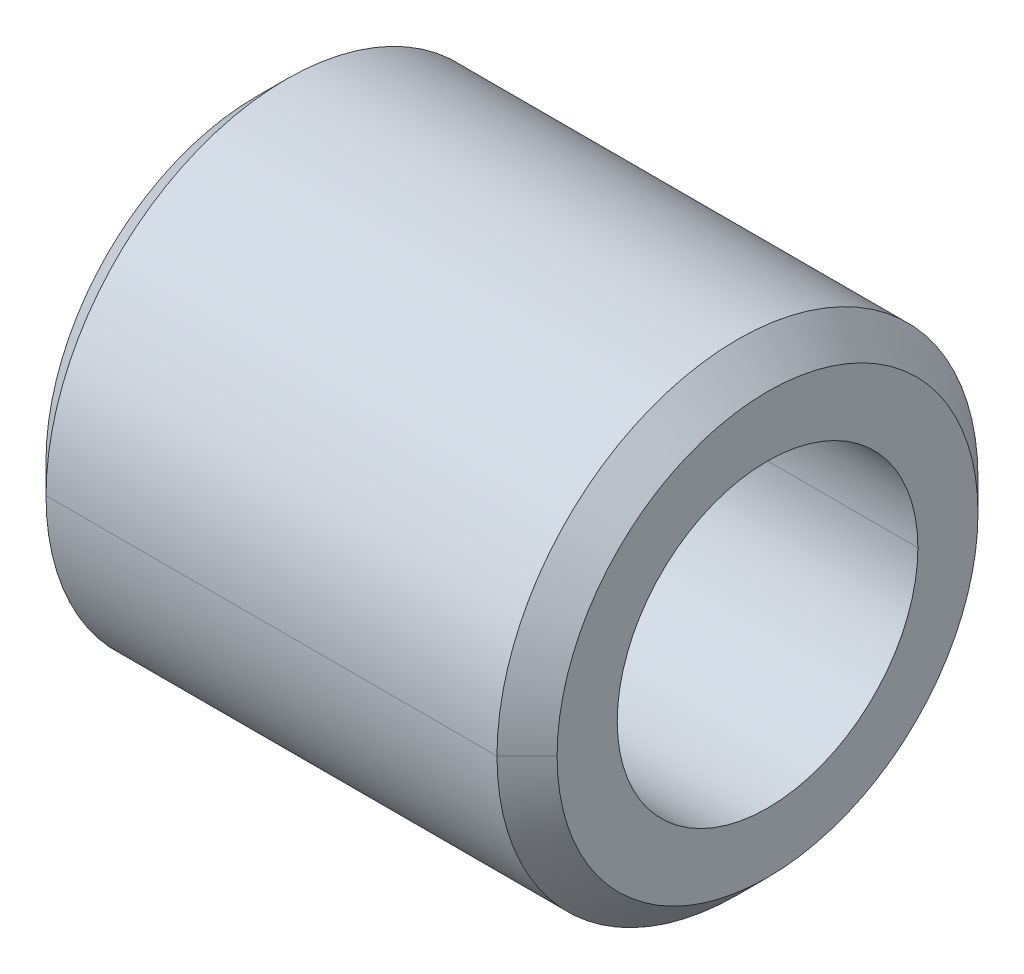
ISO-10303-21;
HEADER;
FILE_DESCRIPTION(('STEP AP214'),'2;1');
FILE_NAME('part.step','',(''),(''),'','','');
FILE_SCHEMA(('AUTOMOTIVE_DESIGN { 1 0 10303 214 1 1 1 1 }'));
ENDSEC;
DATA;
#1=APPLICATION_CONTEXT('core data for automotive mechanical design processes');
#2=APPLICATION_PROTOCOL_DEFINITION('international standard','automotive_design',2000,#1);
#3=PRODUCT_CONTEXT('',#1,'mechanical');
#4=PRODUCT('Part','Part','',(#3));
#5=PRODUCT_RELATED_PRODUCT_CATEGORY('part','',(#4));
#6=PRODUCT_DEFINITION_FORMATION('','',#4);
#7=PRODUCT_DEFINITION_CONTEXT('part definition',#1,'design');
#8=PRODUCT_DEFINITION('design','',#6,#7);
#9=PRODUCT_DEFINITION_SHAPE('','',#8);
#10=(LENGTH_UNIT() NAMED_UNIT(*) SI_UNIT(.MILLI.,.METRE.));
#11=(NAMED_UNIT(*) PLANE_ANGLE_UNIT() SI_UNIT($,.RADIAN.));
#12=(NAMED_UNIT(*) SI_UNIT($,.STERADIAN.) SOLID_ANGLE_UNIT());
#13=UNCERTAINTY_MEASURE_WITH_UNIT(LENGTH_MEASURE(1.E-05),#10,'distance_accuracy_value','');
#14=(GEOMETRIC_REPRESENTATION_CONTEXT(3) GLOBAL_UNCERTAINTY_ASSIGNED_CONTEXT((#13)) GLOBAL_UNIT_ASSIGNED_CONTEXT((#10,
#11,#12)) REPRESENTATION_CONTEXT('',''));
#15=CARTESIAN_POINT('',(0.,0.,0.));
#16=DIRECTION('',(0.,0.,1.));
#17=DIRECTION('',(1.,0.,0.));
#18=AXIS2_PLACEMENT_3D('',#15,#16,#17);
#19=CARTESIAN_POINT('',(4.25,0.,0.));
#20=DIRECTION('',(-1.,0.,0.));
#21=DIRECTION('',(0.,0.,1.));
#22=AXIS2_PLACEMENT_3D('',#19,#20,#21);
#23=CONICAL_SURFACE('',#22,3.5,0.785398163397446);
#24=CARTESIAN_POINT('',(4.25,0.,0.));
#25=DIRECTION('',(1.,0.,0.));
#26=DIRECTION('',(0.,0.,-1.));
#27=AXIS2_PLACEMENT_3D('',#24,#25,#26);
#28=CIRCLE('',#27,3.5);
#29=CARTESIAN_POINT('',(4.25,0.,-3.5));
#30=VERTEX_POINT('',#29);
#31=CARTESIAN_POINT('',(4.25,0.,3.5));
#32=VERTEX_POINT('',#31);
#33=EDGE_CURVE('E48',#30,#32,#28,.T.);
#34=ORIENTED_EDGE('',*,*,#33,.F.);
#35=DIRECTION('',(-0.707106781186549,0.,-0.707106781186546));
#36=VECTOR('',#35,1.);
#37=CARTESIAN_POINT('',(4.25,0.,-3.5));
#38=LINE('',#37,#36);
#39=CARTESIAN_POINT('',(3.75,0.,-4.));
#40=VERTEX_POINT('',#39);
#41=EDGE_CURVE('E13',#30,#40,#38,.T.);
#42=ORIENTED_EDGE('',*,*,#41,.T.);
#43=CARTESIAN_POINT('',(3.75,0.,0.));
#44=DIRECTION('',(-1.,0.,0.));
#45=DIRECTION('',(0.,0.,-1.));
#46=AXIS2_PLACEMENT_3D('',#43,#44,#45);
#47=CIRCLE('',#46,4.);
#48=CARTESIAN_POINT('',(3.75,0.,4.));
#49=VERTEX_POINT('',#48);
#50=EDGE_CURVE('E117',#49,#40,#47,.T.);
#51=ORIENTED_EDGE('',*,*,#50,.F.);
#52=DIRECTION('',(-0.707106781186549,0.,0.707106781186546));
#53=VECTOR('',#52,1.);
#54=CARTESIAN_POINT('',(4.25,0.,3.5));
#55=LINE('',#54,#53);
#56=EDGE_CURVE('E27',#32,#49,#55,.T.);
#57=ORIENTED_EDGE('',*,*,#56,.F.);
#58=EDGE_LOOP('',(#34,#42,#51,#57));
#59=FACE_BOUND('',#58,.T.);
#60=ADVANCED_FACE('F23',(#59),#23,.T.);
#61=CARTESIAN_POINT('',(-3.75,0.,0.));
#62=DIRECTION('',(1.,0.,0.));
#63=DIRECTION('',(0.,0.,-1.));
#64=AXIS2_PLACEMENT_3D('',#61,#62,#63);
#65=CONICAL_SURFACE('',#64,4.,0.78539816339745);
#66=CARTESIAN_POINT('',(-4.25,0.,0.));
#67=DIRECTION('',(-1.,0.,0.));
#68=DIRECTION('',(0.,0.,-1.));
#69=AXIS2_PLACEMENT_3D('',#66,#67,#68);
#70=CIRCLE('',#69,3.5);
#71=CARTESIAN_POINT('',(-4.25,0.,3.5));
#72=VERTEX_POINT('',#71);
#73=CARTESIAN_POINT('',(-4.25,0.,-3.5));
#74=VERTEX_POINT('',#73);
#75=EDGE_CURVE('E145',#72,#74,#70,.T.);
#76=ORIENTED_EDGE('',*,*,#75,.F.);
#77=DIRECTION('',(0.707106781186546,0.,0.707106781186549));
#78=VECTOR('',#77,1.);
#79=CARTESIAN_POINT('',(-3.75,0.,4.));
#80=LINE('',#79,#78);
#81=CARTESIAN_POINT('',(-3.75,0.,4.));
#82=VERTEX_POINT('',#81);
#83=EDGE_CURVE('E34',#72,#82,#80,.T.);
#84=ORIENTED_EDGE('',*,*,#83,.T.);
#85=CARTESIAN_POINT('',(-3.75,0.,0.));
#86=DIRECTION('',(1.,0.,0.));
#87=DIRECTION('',(0.,0.,-1.));
#88=AXIS2_PLACEMENT_3D('',#85,#86,#87);
#89=CIRCLE('',#88,4.);
#90=CARTESIAN_POINT('',(-3.75,0.,-4.));
#91=VERTEX_POINT('',#90);
#92=EDGE_CURVE('E118',#91,#82,#89,.T.);
#93=ORIENTED_EDGE('',*,*,#92,.F.);
#94=DIRECTION('',(0.707106781186546,0.,-0.707106781186549));
#95=VECTOR('',#94,1.);
#96=CARTESIAN_POINT('',(-3.75,0.,-4.));
#97=LINE('',#96,#95);
#98=EDGE_CURVE('E73',#74,#91,#97,.T.);
#99=ORIENTED_EDGE('',*,*,#98,.F.);
#100=EDGE_LOOP('',(#76,#84,#93,#99));
#101=FACE_BOUND('',#100,.T.);
#102=ADVANCED_FACE('F197',(#101),#65,.T.);
#103=CARTESIAN_POINT('',(4.25,0.,0.));
#104=DIRECTION('',(-1.,0.,0.));
#105=DIRECTION('',(0.,0.,1.));
#106=AXIS2_PLACEMENT_3D('',#103,#104,#105);
#107=CYLINDRICAL_SURFACE('',#106,2.5);
#108=CARTESIAN_POINT('',(4.25,0.,0.));
#109=DIRECTION('',(1.,0.,0.));
#110=DIRECTION('',(0.,0.,-1.));
#111=AXIS2_PLACEMENT_3D('',#108,#109,#110);
#112=CIRCLE('',#111,2.5);
#113=CARTESIAN_POINT('',(4.25,0.,2.5));
#114=VERTEX_POINT('',#113);
#115=CARTESIAN_POINT('',(4.25,0.,-2.5));
#116=VERTEX_POINT('',#115);
#117=EDGE_CURVE('E153',#114,#116,#112,.T.);
#118=ORIENTED_EDGE('',*,*,#117,.T.);
#119=DIRECTION('',(-1.,0.,0.));
#120=VECTOR('',#119,1.);
#121=CARTESIAN_POINT('',(4.25,0.,-2.5));
#122=LINE('',#121,#120);
#123=CARTESIAN_POINT('',(-4.25,0.,-2.5));
#124=VERTEX_POINT('',#123);
#125=EDGE_CURVE('E88',#116,#124,#122,.T.);
#126=ORIENTED_EDGE('',*,*,#125,.T.);
#127=CARTESIAN_POINT('',(-4.25,0.,0.));
#128=DIRECTION('',(1.,0.,0.));
#129=DIRECTION('',(0.,0.,-1.));
#130=AXIS2_PLACEMENT_3D('',#127,#128,#129);
#131=CIRCLE('',#130,2.5);
#132=CARTESIAN_POINT('',(-4.25,0.,2.5));
#133=VERTEX_POINT('',#132);
#134=EDGE_CURVE('E136',#133,#124,#131,.T.);
#135=ORIENTED_EDGE('',*,*,#134,.F.);
#136=DIRECTION('',(-1.,0.,0.));
#137=VECTOR('',#136,1.);
#138=CARTESIAN_POINT('',(4.25,0.,2.5));
#139=LINE('',#138,#137);
#140=EDGE_CURVE('E139',#114,#133,#139,.T.);
#141=ORIENTED_EDGE('',*,*,#140,.F.);
#142=EDGE_LOOP('',(#118,#126,#135,#141));
#143=FACE_BOUND('',#142,.T.);
#144=ADVANCED_FACE('F180',(#143),#107,.F.);
#145=CARTESIAN_POINT('',(4.25,0.,0.));
#146=DIRECTION('',(-1.,0.,0.));
#147=DIRECTION('',(0.,0.,1.));
#148=AXIS2_PLACEMENT_3D('',#145,#146,#147);
#149=CYLINDRICAL_SURFACE('',#148,4.);
#150=ORIENTED_EDGE('',*,*,#50,.T.);
#151=DIRECTION('',(-1.,0.,0.));
#152=VECTOR('',#151,1.);
#153=CARTESIAN_POINT('',(4.25,0.,-4.));
#154=LINE('',#153,#152);
#155=EDGE_CURVE('E126',#40,#91,#154,.T.);
#156=ORIENTED_EDGE('',*,*,#155,.T.);
#157=ORIENTED_EDGE('',*,*,#92,.T.);
#158=DIRECTION('',(-1.,0.,0.));
#159=VECTOR('',#158,1.);
#160=CARTESIAN_POINT('',(4.25,0.,4.));
#161=LINE('',#160,#159);
#162=EDGE_CURVE('E114',#49,#82,#161,.T.);
#163=ORIENTED_EDGE('',*,*,#162,.F.);
#164=EDGE_LOOP('',(#150,#156,#157,#163));
#165=FACE_BOUND('',#164,.T.);
#166=ADVANCED_FACE('F115',(#165),#149,.T.);
#167=CARTESIAN_POINT('',(4.25,0.,0.));
#168=DIRECTION('',(1.,0.,0.));
#169=DIRECTION('',(0.,1.,0.));
#170=AXIS2_PLACEMENT_3D('',#167,#168,#169);
#171=PLANE('',#170);
#172=CARTESIAN_POINT('',(4.25,0.,0.));
#173=DIRECTION('',(1.,0.,0.));
#174=DIRECTION('',(0.,0.,-1.));
#175=AXIS2_PLACEMENT_3D('',#172,#173,#174);
#176=CIRCLE('',#175,3.5);
#177=EDGE_CURVE('E107',#32,#30,#176,.T.);
#178=ORIENTED_EDGE('',*,*,#177,.T.);
#179=ORIENTED_EDGE('',*,*,#33,.T.);
#180=EDGE_LOOP('',(#178,#179));
#181=FACE_BOUND('',#180,.T.);
#182=ORIENTED_EDGE('',*,*,#117,.F.);
#183=CARTESIAN_POINT('',(4.25,0.,0.));
#184=DIRECTION('',(1.,0.,0.));
#185=DIRECTION('',(0.,0.,-1.));
#186=AXIS2_PLACEMENT_3D('',#183,#184,#185);
#187=CIRCLE('',#186,2.5);
#188=EDGE_CURVE('E141',#116,#114,#187,.T.);
#189=ORIENTED_EDGE('',*,*,#188,.F.);
#190=EDGE_LOOP('',(#182,#189));
#191=FACE_BOUND('',#190,.T.);
#192=ADVANCED_FACE('F25',(#181,#191),#171,.T.);
#193=CARTESIAN_POINT('',(-4.25,0.,0.));
#194=DIRECTION('',(1.,0.,0.));
#195=DIRECTION('',(0.,1.,0.));
#196=AXIS2_PLACEMENT_3D('',#193,#194,#195);
#197=PLANE('',#196);
#198=CARTESIAN_POINT('',(-4.25,0.,0.));
#199=DIRECTION('',(-1.,0.,0.));
#200=DIRECTION('',(0.,0.,-1.));
#201=AXIS2_PLACEMENT_3D('',#198,#199,#200);
#202=CIRCLE('',#201,3.5);
#203=EDGE_CURVE('E157',#74,#72,#202,.T.);
#204=ORIENTED_EDGE('',*,*,#203,.T.);
#205=ORIENTED_EDGE('',*,*,#75,.T.);
#206=EDGE_LOOP('',(#204,#205));
#207=FACE_BOUND('',#206,.T.);
#208=ORIENTED_EDGE('',*,*,#134,.T.);
#209=CARTESIAN_POINT('',(-4.25,0.,0.));
#210=DIRECTION('',(1.,0.,0.));
#211=DIRECTION('',(0.,0.,-1.));
#212=AXIS2_PLACEMENT_3D('',#209,#210,#211);
#213=CIRCLE('',#212,2.5);
#214=EDGE_CURVE('E130',#124,#133,#213,.T.);
#215=ORIENTED_EDGE('',*,*,#214,.T.);
#216=EDGE_LOOP('',(#208,#215));
#217=FACE_BOUND('',#216,.T.);
#218=ADVANCED_FACE('F184',(#207,#217),#197,.F.);
#219=CARTESIAN_POINT('',(4.25,0.,0.));
#220=DIRECTION('',(-1.,0.,0.));
#221=DIRECTION('',(0.,0.,1.));
#222=AXIS2_PLACEMENT_3D('',#219,#220,#221);
#223=CYLINDRICAL_SURFACE('',#222,4.);
#224=ORIENTED_EDGE('',*,*,#155,.F.);
#225=CARTESIAN_POINT('',(3.75,0.,0.));
#226=DIRECTION('',(-1.,0.,0.));
#227=DIRECTION('',(0.,0.,-1.));
#228=AXIS2_PLACEMENT_3D('',#225,#226,#227);
#229=CIRCLE('',#228,4.);
#230=EDGE_CURVE('E105',#40,#49,#229,.T.);
#231=ORIENTED_EDGE('',*,*,#230,.T.);
#232=ORIENTED_EDGE('',*,*,#162,.T.);
#233=CARTESIAN_POINT('',(-3.75,0.,0.));
#234=DIRECTION('',(1.,0.,0.));
#235=DIRECTION('',(0.,0.,-1.));
#236=AXIS2_PLACEMENT_3D('',#233,#234,#235);
#237=CIRCLE('',#236,4.);
#238=EDGE_CURVE('E123',#82,#91,#237,.T.);
#239=ORIENTED_EDGE('',*,*,#238,.T.);
#240=EDGE_LOOP('',(#224,#231,#232,#239));
#241=FACE_BOUND('',#240,.T.);
#242=ADVANCED_FACE('F128',(#241),#223,.T.);
#243=CARTESIAN_POINT('',(4.25,0.,0.));
#244=DIRECTION('',(-1.,0.,0.));
#245=DIRECTION('',(0.,0.,1.));
#246=AXIS2_PLACEMENT_3D('',#243,#244,#245);
#247=CYLINDRICAL_SURFACE('',#246,2.5);
#248=ORIENTED_EDGE('',*,*,#125,.F.);
#249=ORIENTED_EDGE('',*,*,#188,.T.);
#250=ORIENTED_EDGE('',*,*,#140,.T.);
#251=ORIENTED_EDGE('',*,*,#214,.F.);
#252=EDGE_LOOP('',(#248,#249,#250,#251));
#253=FACE_BOUND('',#252,.T.);
#254=ADVANCED_FACE('F175',(#253),#247,.F.);
#255=CARTESIAN_POINT('',(-3.75,0.,0.));
#256=DIRECTION('',(1.,0.,0.));
#257=DIRECTION('',(0.,0.,-1.));
#258=AXIS2_PLACEMENT_3D('',#255,#256,#257);
#259=CONICAL_SURFACE('',#258,4.,0.78539816339745);
#260=ORIENTED_EDGE('',*,*,#83,.F.);
#261=ORIENTED_EDGE('',*,*,#203,.F.);
#262=ORIENTED_EDGE('',*,*,#98,.T.);
#263=ORIENTED_EDGE('',*,*,#238,.F.);
#264=EDGE_LOOP('',(#260,#261,#262,#263));
#265=FACE_BOUND('',#264,.T.);
#266=ADVANCED_FACE('F207',(#265),#259,.T.);
#267=CARTESIAN_POINT('',(4.25,0.,0.));
#268=DIRECTION('',(-1.,0.,0.));
#269=DIRECTION('',(0.,0.,1.));
#270=AXIS2_PLACEMENT_3D('',#267,#268,#269);
#271=CONICAL_SURFACE('',#270,3.5,0.785398163397446);
#272=ORIENTED_EDGE('',*,*,#41,.F.);
#273=ORIENTED_EDGE('',*,*,#177,.F.);
#274=ORIENTED_EDGE('',*,*,#56,.T.);
#275=ORIENTED_EDGE('',*,*,#230,.F.);
#276=EDGE_LOOP('',(#272,#273,#274,#275));
#277=FACE_BOUND('',#276,.T.);
#278=ADVANCED_FACE('F103',(#277),#271,.T.);
#279=CLOSED_SHELL('',(#60,#102,#144,#166,#192,#218,#242,#254,#266,#278));
#280=MANIFOLD_SOLID_BREP('B1',#279);
#281=ADVANCED_BREP_SHAPE_REPRESENTATION('',(#18,#280),#14);
#282=SHAPE_DEFINITION_REPRESENTATION(#9,#281);
ENDSEC;
END-ISO-10303-21;
